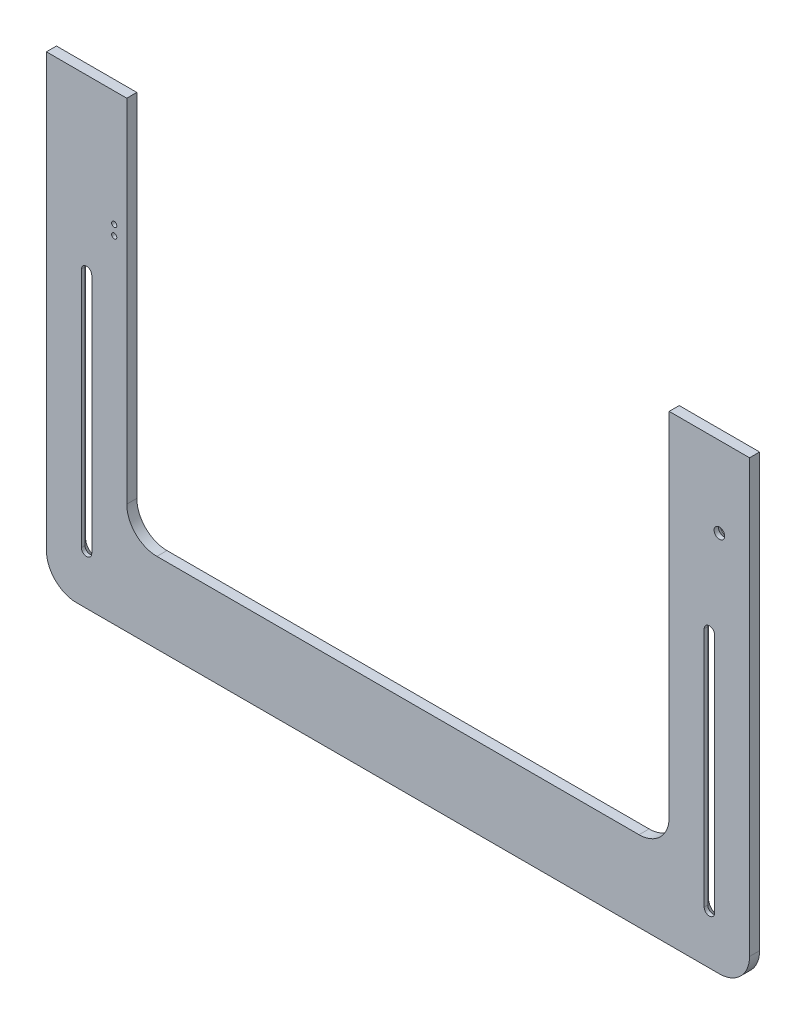
ISO-10303-21;
HEADER;
FILE_DESCRIPTION(('STEP AP214'),'2;1');
FILE_NAME('part.step','',(''),(''),'','','');
FILE_SCHEMA(('AUTOMOTIVE_DESIGN { 1 0 10303 214 1 1 1 1 }'));
ENDSEC;
DATA;
#1=APPLICATION_CONTEXT('core data for automotive mechanical design processes');
#2=APPLICATION_PROTOCOL_DEFINITION('international standard','automotive_design',2000,#1);
#3=PRODUCT_CONTEXT('',#1,'mechanical');
#4=PRODUCT('Part','Part','',(#3));
#5=PRODUCT_RELATED_PRODUCT_CATEGORY('part','',(#4));
#6=PRODUCT_DEFINITION_FORMATION('','',#4);
#7=PRODUCT_DEFINITION_CONTEXT('part definition',#1,'design');
#8=PRODUCT_DEFINITION('design','',#6,#7);
#9=PRODUCT_DEFINITION_SHAPE('','',#8);
#10=(LENGTH_UNIT() NAMED_UNIT(*) SI_UNIT(.MILLI.,.METRE.));
#11=(NAMED_UNIT(*) PLANE_ANGLE_UNIT() SI_UNIT($,.RADIAN.));
#12=(NAMED_UNIT(*) SI_UNIT($,.STERADIAN.) SOLID_ANGLE_UNIT());
#13=UNCERTAINTY_MEASURE_WITH_UNIT(LENGTH_MEASURE(1.E-05),#10,'distance_accuracy_value','');
#14=(GEOMETRIC_REPRESENTATION_CONTEXT(3) GLOBAL_UNCERTAINTY_ASSIGNED_CONTEXT((#13)) GLOBAL_UNIT_ASSIGNED_CONTEXT((#10,
#11,#12)) REPRESENTATION_CONTEXT('',''));
#15=CARTESIAN_POINT('',(0.,0.,0.));
#16=DIRECTION('',(0.,0.,1.));
#17=DIRECTION('',(1.,0.,0.));
#18=AXIS2_PLACEMENT_3D('',#15,#16,#17);
#19=CARTESIAN_POINT('',(374.65,-222.25,6.35));
#20=DIRECTION('',(0.,0.,1.));
#21=DIRECTION('',(1.,0.,0.));
#22=AXIS2_PLACEMENT_3D('',#19,#20,#21);
#23=CYLINDRICAL_SURFACE('',#22,19.05);
#24=DIRECTION('',(0.,0.,-1.));
#25=VECTOR('',#24,1.);
#26=CARTESIAN_POINT('',(374.65,-241.3,6.35));
#27=LINE('',#26,#25);
#28=CARTESIAN_POINT('',(374.65,-241.3,6.35));
#29=VERTEX_POINT('',#28);
#30=CARTESIAN_POINT('',(374.65,-241.3,0.));
#31=VERTEX_POINT('',#30);
#32=EDGE_CURVE('E351',#29,#31,#27,.T.);
#33=ORIENTED_EDGE('',*,*,#32,.F.);
#34=CARTESIAN_POINT('',(374.65,-222.25,6.35));
#35=DIRECTION('',(0.,0.,1.));
#36=DIRECTION('',(1.,0.,0.));
#37=AXIS2_PLACEMENT_3D('',#34,#35,#36);
#38=CIRCLE('',#37,19.05);
#39=CARTESIAN_POINT('',(393.7,-222.25,6.35));
#40=VERTEX_POINT('',#39);
#41=EDGE_CURVE('E357',#29,#40,#38,.T.);
#42=ORIENTED_EDGE('',*,*,#41,.T.);
#43=DIRECTION('',(0.,0.,-1.));
#44=VECTOR('',#43,1.);
#45=CARTESIAN_POINT('',(393.7,-222.25,6.35));
#46=LINE('',#45,#44);
#47=CARTESIAN_POINT('',(393.7,-222.25,0.));
#48=VERTEX_POINT('',#47);
#49=EDGE_CURVE('E354',#48,#40,#46,.F.);
#50=ORIENTED_EDGE('',*,*,#49,.F.);
#51=CARTESIAN_POINT('',(374.65,-222.25,0.));
#52=DIRECTION('',(0.,0.,1.));
#53=DIRECTION('',(1.,0.,0.));
#54=AXIS2_PLACEMENT_3D('',#51,#52,#53);
#55=CIRCLE('',#54,19.05);
#56=EDGE_CURVE('E359',#48,#31,#55,.F.);
#57=ORIENTED_EDGE('',*,*,#56,.T.);
#58=EDGE_LOOP('',(#33,#42,#50,#57));
#59=FACE_BOUND('',#58,.T.);
#60=ADVANCED_FACE('F39',(#59),#23,.F.);
#61=CARTESIAN_POINT('',(69.85,-222.25,6.35));
#62=DIRECTION('',(0.,0.,1.));
#63=DIRECTION('',(1.,0.,0.));
#64=AXIS2_PLACEMENT_3D('',#61,#62,#63);
#65=CYLINDRICAL_SURFACE('',#64,19.05);
#66=DIRECTION('',(0.,0.,-1.));
#67=VECTOR('',#66,1.);
#68=CARTESIAN_POINT('',(50.8,-222.25,6.35));
#69=LINE('',#68,#67);
#70=CARTESIAN_POINT('',(50.8,-222.25,6.35));
#71=VERTEX_POINT('',#70);
#72=CARTESIAN_POINT('',(50.8,-222.25,0.));
#73=VERTEX_POINT('',#72);
#74=EDGE_CURVE('E340',#71,#73,#69,.T.);
#75=ORIENTED_EDGE('',*,*,#74,.F.);
#76=CARTESIAN_POINT('',(69.85,-222.25,6.35));
#77=DIRECTION('',(0.,0.,1.));
#78=DIRECTION('',(1.,0.,0.));
#79=AXIS2_PLACEMENT_3D('',#76,#77,#78);
#80=CIRCLE('',#79,19.05);
#81=CARTESIAN_POINT('',(69.85,-241.3,6.35));
#82=VERTEX_POINT('',#81);
#83=EDGE_CURVE('E346',#71,#82,#80,.T.);
#84=ORIENTED_EDGE('',*,*,#83,.T.);
#85=DIRECTION('',(0.,0.,-1.));
#86=VECTOR('',#85,1.);
#87=CARTESIAN_POINT('',(69.85,-241.3,6.35));
#88=LINE('',#87,#86);
#89=CARTESIAN_POINT('',(69.85,-241.3,0.));
#90=VERTEX_POINT('',#89);
#91=EDGE_CURVE('E343',#90,#82,#88,.F.);
#92=ORIENTED_EDGE('',*,*,#91,.F.);
#93=CARTESIAN_POINT('',(69.85,-222.25,0.));
#94=DIRECTION('',(0.,0.,1.));
#95=DIRECTION('',(1.,0.,0.));
#96=AXIS2_PLACEMENT_3D('',#93,#94,#95);
#97=CIRCLE('',#96,19.05);
#98=EDGE_CURVE('E349',#90,#73,#97,.F.);
#99=ORIENTED_EDGE('',*,*,#98,.T.);
#100=EDGE_LOOP('',(#75,#84,#92,#99));
#101=FACE_BOUND('',#100,.T.);
#102=ADVANCED_FACE('F488',(#101),#65,.F.);
#103=CARTESIAN_POINT('',(425.45,-273.05,6.35));
#104=DIRECTION('',(0.,0.,1.));
#105=DIRECTION('',(1.,0.,0.));
#106=AXIS2_PLACEMENT_3D('',#103,#104,#105);
#107=CYLINDRICAL_SURFACE('',#106,19.05);
#108=DIRECTION('',(0.,0.,1.));
#109=VECTOR('',#108,1.);
#110=CARTESIAN_POINT('',(425.45,-292.1,6.35));
#111=LINE('',#110,#109);
#112=CARTESIAN_POINT('',(425.45,-292.1,0.));
#113=VERTEX_POINT('',#112);
#114=CARTESIAN_POINT('',(425.45,-292.1,6.35));
#115=VERTEX_POINT('',#114);
#116=EDGE_CURVE('E330',#113,#115,#111,.T.);
#117=ORIENTED_EDGE('',*,*,#116,.F.);
#118=CARTESIAN_POINT('',(425.45,-273.05,0.));
#119=DIRECTION('',(0.,0.,1.));
#120=DIRECTION('',(1.,0.,0.));
#121=AXIS2_PLACEMENT_3D('',#118,#119,#120);
#122=CIRCLE('',#121,19.05);
#123=CARTESIAN_POINT('',(444.5,-273.05,0.));
#124=VERTEX_POINT('',#123);
#125=EDGE_CURVE('E336',#124,#113,#122,.F.);
#126=ORIENTED_EDGE('',*,*,#125,.F.);
#127=DIRECTION('',(0.,0.,1.));
#128=VECTOR('',#127,1.);
#129=CARTESIAN_POINT('',(444.5,-273.05,6.35));
#130=LINE('',#129,#128);
#131=CARTESIAN_POINT('',(444.5,-273.05,6.35));
#132=VERTEX_POINT('',#131);
#133=EDGE_CURVE('E333',#132,#124,#130,.F.);
#134=ORIENTED_EDGE('',*,*,#133,.F.);
#135=CARTESIAN_POINT('',(425.45,-273.05,6.35));
#136=DIRECTION('',(0.,0.,1.));
#137=DIRECTION('',(1.,0.,0.));
#138=AXIS2_PLACEMENT_3D('',#135,#136,#137);
#139=CIRCLE('',#138,19.05);
#140=EDGE_CURVE('E338',#115,#132,#139,.T.);
#141=ORIENTED_EDGE('',*,*,#140,.F.);
#142=EDGE_LOOP('',(#117,#126,#134,#141));
#143=FACE_BOUND('',#142,.T.);
#144=ADVANCED_FACE('F464',(#143),#107,.T.);
#145=CARTESIAN_POINT('',(19.05,-273.05,6.35));
#146=DIRECTION('',(0.,0.,1.));
#147=DIRECTION('',(1.,0.,0.));
#148=AXIS2_PLACEMENT_3D('',#145,#146,#147);
#149=CYLINDRICAL_SURFACE('',#148,19.05);
#150=DIRECTION('',(0.,0.,1.));
#151=VECTOR('',#150,1.);
#152=CARTESIAN_POINT('',(0.,-273.05,6.35));
#153=LINE('',#152,#151);
#154=CARTESIAN_POINT('',(0.,-273.05,0.));
#155=VERTEX_POINT('',#154);
#156=CARTESIAN_POINT('',(0.,-273.05,6.35));
#157=VERTEX_POINT('',#156);
#158=EDGE_CURVE('E320',#155,#157,#153,.T.);
#159=ORIENTED_EDGE('',*,*,#158,.F.);
#160=CARTESIAN_POINT('',(19.05,-273.05,0.));
#161=DIRECTION('',(0.,0.,1.));
#162=DIRECTION('',(1.,0.,0.));
#163=AXIS2_PLACEMENT_3D('',#160,#161,#162);
#164=CIRCLE('',#163,19.05);
#165=CARTESIAN_POINT('',(19.05,-292.1,0.));
#166=VERTEX_POINT('',#165);
#167=EDGE_CURVE('E326',#166,#155,#164,.F.);
#168=ORIENTED_EDGE('',*,*,#167,.F.);
#169=DIRECTION('',(0.,0.,1.));
#170=VECTOR('',#169,1.);
#171=CARTESIAN_POINT('',(19.05,-292.1,6.35));
#172=LINE('',#171,#170);
#173=CARTESIAN_POINT('',(19.05,-292.1,6.35));
#174=VERTEX_POINT('',#173);
#175=EDGE_CURVE('E323',#174,#166,#172,.F.);
#176=ORIENTED_EDGE('',*,*,#175,.F.);
#177=CARTESIAN_POINT('',(19.05,-273.05,6.35));
#178=DIRECTION('',(0.,0.,1.));
#179=DIRECTION('',(1.,0.,0.));
#180=AXIS2_PLACEMENT_3D('',#177,#178,#179);
#181=CIRCLE('',#180,19.05);
#182=EDGE_CURVE('E328',#157,#174,#181,.T.);
#183=ORIENTED_EDGE('',*,*,#182,.F.);
#184=EDGE_LOOP('',(#159,#168,#176,#183));
#185=FACE_BOUND('',#184,.T.);
#186=ADVANCED_FACE('F471',(#185),#149,.T.);
#187=CARTESIAN_POINT('',(50.8,0.,6.35));
#188=DIRECTION('',(0.,-1.,0.));
#189=DIRECTION('',(1.,0.,0.));
#190=AXIS2_PLACEMENT_3D('',#187,#188,#189);
#191=PLANE('',#190);
#192=DIRECTION('',(-1.,0.,0.));
#193=VECTOR('',#192,1.);
#194=CARTESIAN_POINT('',(50.8,0.,0.));
#195=LINE('',#194,#193);
#196=CARTESIAN_POINT('',(50.8,0.,0.));
#197=VERTEX_POINT('',#196);
#198=CARTESIAN_POINT('',(0.,0.,0.));
#199=VERTEX_POINT('',#198);
#200=EDGE_CURVE('E255',#197,#199,#195,.T.);
#201=ORIENTED_EDGE('',*,*,#200,.T.);
#202=DIRECTION('',(0.,0.,-1.));
#203=VECTOR('',#202,1.);
#204=CARTESIAN_POINT('',(0.,0.,6.35));
#205=LINE('',#204,#203);
#206=CARTESIAN_POINT('',(0.,0.,6.35));
#207=VERTEX_POINT('',#206);
#208=EDGE_CURVE('E317',#207,#199,#205,.T.);
#209=ORIENTED_EDGE('',*,*,#208,.F.);
#210=DIRECTION('',(-1.,0.,0.));
#211=VECTOR('',#210,1.);
#212=CARTESIAN_POINT('',(50.8,0.,6.35));
#213=LINE('',#212,#211);
#214=CARTESIAN_POINT('',(50.8,0.,6.35));
#215=VERTEX_POINT('',#214);
#216=EDGE_CURVE('E261',#215,#207,#213,.T.);
#217=ORIENTED_EDGE('',*,*,#216,.F.);
#218=DIRECTION('',(0.,0.,-1.));
#219=VECTOR('',#218,1.);
#220=CARTESIAN_POINT('',(50.8,0.,6.35));
#221=LINE('',#220,#219);
#222=EDGE_CURVE('E285',#215,#197,#221,.T.);
#223=ORIENTED_EDGE('',*,*,#222,.T.);
#224=EDGE_LOOP('',(#201,#209,#217,#223));
#225=FACE_BOUND('',#224,.T.);
#226=ADVANCED_FACE('F477',(#225),#191,.F.);
#227=CARTESIAN_POINT('',(0.,0.,6.35));
#228=DIRECTION('',(1.,0.,0.));
#229=DIRECTION('',(0.,1.,0.));
#230=AXIS2_PLACEMENT_3D('',#227,#228,#229);
#231=PLANE('',#230);
#232=DIRECTION('',(0.,-1.,0.));
#233=VECTOR('',#232,1.);
#234=CARTESIAN_POINT('',(0.,0.,0.));
#235=LINE('',#234,#233);
#236=EDGE_CURVE('E288',#199,#155,#235,.T.);
#237=ORIENTED_EDGE('',*,*,#236,.T.);
#238=ORIENTED_EDGE('',*,*,#158,.T.);
#239=DIRECTION('',(0.,-1.,0.));
#240=VECTOR('',#239,1.);
#241=CARTESIAN_POINT('',(0.,0.,6.35));
#242=LINE('',#241,#240);
#243=EDGE_CURVE('E264',#207,#157,#242,.T.);
#244=ORIENTED_EDGE('',*,*,#243,.F.);
#245=ORIENTED_EDGE('',*,*,#208,.T.);
#246=EDGE_LOOP('',(#237,#238,#244,#245));
#247=FACE_BOUND('',#246,.T.);
#248=ADVANCED_FACE('F473',(#247),#231,.F.);
#249=CARTESIAN_POINT('',(0.,-292.1,6.35));
#250=DIRECTION('',(0.,1.,0.));
#251=DIRECTION('',(0.,0.,1.));
#252=AXIS2_PLACEMENT_3D('',#249,#250,#251);
#253=PLANE('',#252);
#254=DIRECTION('',(1.,0.,0.));
#255=VECTOR('',#254,1.);
#256=CARTESIAN_POINT('',(0.,-292.1,0.));
#257=LINE('',#256,#255);
#258=EDGE_CURVE('E291',#166,#113,#257,.T.);
#259=ORIENTED_EDGE('',*,*,#258,.T.);
#260=ORIENTED_EDGE('',*,*,#116,.T.);
#261=DIRECTION('',(1.,0.,0.));
#262=VECTOR('',#261,1.);
#263=CARTESIAN_POINT('',(0.,-292.1,6.35));
#264=LINE('',#263,#262);
#265=EDGE_CURVE('E268',#174,#115,#264,.T.);
#266=ORIENTED_EDGE('',*,*,#265,.F.);
#267=ORIENTED_EDGE('',*,*,#175,.T.);
#268=EDGE_LOOP('',(#259,#260,#266,#267));
#269=FACE_BOUND('',#268,.T.);
#270=ADVANCED_FACE('F466',(#269),#253,.F.);
#271=CARTESIAN_POINT('',(444.5,-292.1,6.35));
#272=DIRECTION('',(-1.,0.,0.));
#273=DIRECTION('',(0.,0.,1.));
#274=AXIS2_PLACEMENT_3D('',#271,#272,#273);
#275=PLANE('',#274);
#276=DIRECTION('',(0.,1.,0.));
#277=VECTOR('',#276,1.);
#278=CARTESIAN_POINT('',(444.5,-292.1,6.35));
#279=LINE('',#278,#277);
#280=CARTESIAN_POINT('',(444.5,0.,6.35));
#281=VERTEX_POINT('',#280);
#282=EDGE_CURVE('E271',#132,#281,#279,.T.);
#283=ORIENTED_EDGE('',*,*,#282,.F.);
#284=ORIENTED_EDGE('',*,*,#133,.T.);
#285=DIRECTION('',(0.,1.,0.));
#286=VECTOR('',#285,1.);
#287=CARTESIAN_POINT('',(444.5,-292.1,0.));
#288=LINE('',#287,#286);
#289=CARTESIAN_POINT('',(444.5,0.,0.));
#290=VERTEX_POINT('',#289);
#291=EDGE_CURVE('E294',#124,#290,#288,.T.);
#292=ORIENTED_EDGE('',*,*,#291,.T.);
#293=DIRECTION('',(0.,0.,-1.));
#294=VECTOR('',#293,1.);
#295=CARTESIAN_POINT('',(444.5,0.,6.35));
#296=LINE('',#295,#294);
#297=EDGE_CURVE('E313',#281,#290,#296,.T.);
#298=ORIENTED_EDGE('',*,*,#297,.F.);
#299=EDGE_LOOP('',(#283,#284,#292,#298));
#300=FACE_BOUND('',#299,.T.);
#301=ADVANCED_FACE('F454',(#300),#275,.F.);
#302=CARTESIAN_POINT('',(444.5,0.,6.35));
#303=DIRECTION('',(0.,-1.,0.));
#304=DIRECTION('',(1.,0.,0.));
#305=AXIS2_PLACEMENT_3D('',#302,#303,#304);
#306=PLANE('',#305);
#307=DIRECTION('',(-1.,0.,0.));
#308=VECTOR('',#307,1.);
#309=CARTESIAN_POINT('',(444.5,0.,0.));
#310=LINE('',#309,#308);
#311=CARTESIAN_POINT('',(393.7,0.,0.));
#312=VERTEX_POINT('',#311);
#313=EDGE_CURVE('E297',#290,#312,#310,.T.);
#314=ORIENTED_EDGE('',*,*,#313,.T.);
#315=DIRECTION('',(0.,0.,-1.));
#316=VECTOR('',#315,1.);
#317=CARTESIAN_POINT('',(393.7,0.,6.35));
#318=LINE('',#317,#316);
#319=CARTESIAN_POINT('',(393.7,0.,6.35));
#320=VERTEX_POINT('',#319);
#321=EDGE_CURVE('E309',#320,#312,#318,.T.);
#322=ORIENTED_EDGE('',*,*,#321,.F.);
#323=DIRECTION('',(-1.,0.,0.));
#324=VECTOR('',#323,1.);
#325=CARTESIAN_POINT('',(444.5,0.,6.35));
#326=LINE('',#325,#324);
#327=EDGE_CURVE('E274',#281,#320,#326,.T.);
#328=ORIENTED_EDGE('',*,*,#327,.F.);
#329=ORIENTED_EDGE('',*,*,#297,.T.);
#330=EDGE_LOOP('',(#314,#322,#328,#329));
#331=FACE_BOUND('',#330,.T.);
#332=ADVANCED_FACE('F458',(#331),#306,.F.);
#333=CARTESIAN_POINT('',(393.7,0.,6.35));
#334=DIRECTION('',(1.,0.,0.));
#335=DIRECTION('',(0.,1.,0.));
#336=AXIS2_PLACEMENT_3D('',#333,#334,#335);
#337=PLANE('',#336);
#338=DIRECTION('',(0.,-1.,0.));
#339=VECTOR('',#338,1.);
#340=CARTESIAN_POINT('',(393.7,0.,0.));
#341=LINE('',#340,#339);
#342=EDGE_CURVE('E300',#312,#48,#341,.T.);
#343=ORIENTED_EDGE('',*,*,#342,.T.);
#344=ORIENTED_EDGE('',*,*,#49,.T.);
#345=DIRECTION('',(0.,-1.,0.));
#346=VECTOR('',#345,1.);
#347=CARTESIAN_POINT('',(393.7,0.,6.35));
#348=LINE('',#347,#346);
#349=EDGE_CURVE('E277',#320,#40,#348,.T.);
#350=ORIENTED_EDGE('',*,*,#349,.F.);
#351=ORIENTED_EDGE('',*,*,#321,.T.);
#352=EDGE_LOOP('',(#343,#344,#350,#351));
#353=FACE_BOUND('',#352,.T.);
#354=ADVANCED_FACE('F496',(#353),#337,.F.);
#355=CARTESIAN_POINT('',(393.7,-241.3,6.35));
#356=DIRECTION('',(0.,-1.,0.));
#357=DIRECTION('',(1.,0.,0.));
#358=AXIS2_PLACEMENT_3D('',#355,#356,#357);
#359=PLANE('',#358);
#360=DIRECTION('',(-1.,0.,0.));
#361=VECTOR('',#360,1.);
#362=CARTESIAN_POINT('',(393.7,-241.3,6.35));
#363=LINE('',#362,#361);
#364=EDGE_CURVE('E281',#29,#82,#363,.T.);
#365=ORIENTED_EDGE('',*,*,#364,.F.);
#366=ORIENTED_EDGE('',*,*,#32,.T.);
#367=DIRECTION('',(-1.,0.,0.));
#368=VECTOR('',#367,1.);
#369=CARTESIAN_POINT('',(393.7,-241.3,0.));
#370=LINE('',#369,#368);
#371=EDGE_CURVE('E304',#31,#90,#370,.T.);
#372=ORIENTED_EDGE('',*,*,#371,.T.);
#373=ORIENTED_EDGE('',*,*,#91,.T.);
#374=EDGE_LOOP('',(#365,#366,#372,#373));
#375=FACE_BOUND('',#374,.T.);
#376=ADVANCED_FACE('F491',(#375),#359,.F.);
#377=CARTESIAN_POINT('',(50.8,-241.3,6.35));
#378=DIRECTION('',(-1.,0.,0.));
#379=DIRECTION('',(0.,-1.,0.));
#380=AXIS2_PLACEMENT_3D('',#377,#378,#379);
#381=PLANE('',#380);
#382=DIRECTION('',(0.,1.,0.));
#383=VECTOR('',#382,1.);
#384=CARTESIAN_POINT('',(50.8,-241.3,6.35));
#385=LINE('',#384,#383);
#386=EDGE_CURVE('E283',#71,#215,#385,.T.);
#387=ORIENTED_EDGE('',*,*,#386,.F.);
#388=ORIENTED_EDGE('',*,*,#74,.T.);
#389=DIRECTION('',(0.,1.,0.));
#390=VECTOR('',#389,1.);
#391=CARTESIAN_POINT('',(50.8,-241.3,0.));
#392=LINE('',#391,#390);
#393=EDGE_CURVE('E265',#73,#197,#392,.T.);
#394=ORIENTED_EDGE('',*,*,#393,.T.);
#395=ORIENTED_EDGE('',*,*,#222,.F.);
#396=EDGE_LOOP('',(#387,#388,#394,#395));
#397=FACE_BOUND('',#396,.T.);
#398=ADVANCED_FACE('F485',(#397),#381,.F.);
#399=CARTESIAN_POINT('',(0.,0.,6.35));
#400=DIRECTION('',(0.,0.,1.));
#401=DIRECTION('',(1.,0.,0.));
#402=AXIS2_PLACEMENT_3D('',#399,#400,#401);
#403=PLANE('',#402);
#404=CARTESIAN_POINT('',(42.8625000000001,-79.3750000000001,6.34999999999999));
#405=DIRECTION('',(0.,0.,-1.));
#406=DIRECTION('',(-1.,0.,0.));
#407=AXIS2_PLACEMENT_3D('',#404,#405,#406);
#408=CIRCLE('',#407,1.63194999999999);
#409=CARTESIAN_POINT('',(41.2305500000001,-79.3750000000001,6.34999999999999));
#410=VERTEX_POINT('',#409);
#411=EDGE_CURVE('E764',#410,#410,#408,.T.);
#412=ORIENTED_EDGE('',*,*,#411,.T.);
#413=EDGE_LOOP('',(#412));
#414=FACE_BOUND('',#413,.T.);
#415=CARTESIAN_POINT('',(42.8625000000001,-73.0250000000001,6.34999999999999));
#416=DIRECTION('',(0.,0.,-1.));
#417=DIRECTION('',(-1.,0.,0.));
#418=AXIS2_PLACEMENT_3D('',#415,#416,#417);
#419=CIRCLE('',#418,1.63194999999999);
#420=CARTESIAN_POINT('',(41.2305500000001,-73.0250000000001,6.34999999999999));
#421=VERTEX_POINT('',#420);
#422=EDGE_CURVE('E406',#421,#421,#419,.T.);
#423=ORIENTED_EDGE('',*,*,#422,.T.);
#424=EDGE_LOOP('',(#423));
#425=FACE_BOUND('',#424,.T.);
#426=CARTESIAN_POINT('',(425.45,-50.8000000000005,6.35));
#427=DIRECTION('',(0.,0.,-1.));
#428=DIRECTION('',(-1.,0.,0.));
#429=AXIS2_PLACEMENT_3D('',#426,#427,#428);
#430=CIRCLE('',#429,3.3782);
#431=CARTESIAN_POINT('',(422.0718,-50.8000000000005,6.35));
#432=VERTEX_POINT('',#431);
#433=EDGE_CURVE('E783',#432,#432,#430,.T.);
#434=ORIENTED_EDGE('',*,*,#433,.T.);
#435=EDGE_LOOP('',(#434));
#436=FACE_BOUND('',#435,.T.);
#437=CARTESIAN_POINT('',(25.4,-107.95,6.35));
#438=DIRECTION('',(0.,0.,1.));
#439=DIRECTION('',(1.,0.,0.));
#440=AXIS2_PLACEMENT_3D('',#437,#438,#439);
#441=CIRCLE('',#440,3.26389999999989);
#442=CARTESIAN_POINT('',(28.6638999999999,-107.95,6.35));
#443=VERTEX_POINT('',#442);
#444=CARTESIAN_POINT('',(22.1361000000001,-107.95,6.35));
#445=VERTEX_POINT('',#444);
#446=EDGE_CURVE('E226',#443,#445,#441,.T.);
#447=ORIENTED_EDGE('',*,*,#446,.F.);
#448=DIRECTION('',(0.,1.,0.));
#449=VECTOR('',#448,1.);
#450=CARTESIAN_POINT('',(28.6638999999999,-107.95,6.35));
#451=LINE('',#450,#449);
#452=CARTESIAN_POINT('',(28.6639,-260.35,6.35));
#453=VERTEX_POINT('',#452);
#454=EDGE_CURVE('E231',#453,#443,#451,.T.);
#455=ORIENTED_EDGE('',*,*,#454,.F.);
#456=CARTESIAN_POINT('',(25.4,-260.35,6.35));
#457=DIRECTION('',(0.,0.,1.));
#458=DIRECTION('',(1.,0.,0.));
#459=AXIS2_PLACEMENT_3D('',#456,#457,#458);
#460=CIRCLE('',#459,3.26389999999995);
#461=CARTESIAN_POINT('',(22.1361,-260.35,6.35));
#462=VERTEX_POINT('',#461);
#463=EDGE_CURVE('E209',#462,#453,#460,.T.);
#464=ORIENTED_EDGE('',*,*,#463,.F.);
#465=DIRECTION('',(0.,-1.,0.));
#466=VECTOR('',#465,1.);
#467=CARTESIAN_POINT('',(22.1361000000001,-107.95,6.35));
#468=LINE('',#467,#466);
#469=EDGE_CURVE('E220',#445,#462,#468,.T.);
#470=ORIENTED_EDGE('',*,*,#469,.F.);
#471=EDGE_LOOP('',(#447,#455,#464,#470));
#472=FACE_BOUND('',#471,.T.);
#473=CARTESIAN_POINT('',(419.1,-107.95,6.35));
#474=DIRECTION('',(0.,0.,1.));
#475=DIRECTION('',(1.,0.,0.));
#476=AXIS2_PLACEMENT_3D('',#473,#474,#475);
#477=CIRCLE('',#476,3.26389999999993);
#478=CARTESIAN_POINT('',(422.3639,-107.95,6.35));
#479=VERTEX_POINT('',#478);
#480=CARTESIAN_POINT('',(415.8361,-107.95,6.35));
#481=VERTEX_POINT('',#480);
#482=EDGE_CURVE('E238',#479,#481,#477,.T.);
#483=ORIENTED_EDGE('',*,*,#482,.F.);
#484=DIRECTION('',(0.,1.,0.));
#485=VECTOR('',#484,1.);
#486=CARTESIAN_POINT('',(422.3639,-107.95,6.35));
#487=LINE('',#486,#485);
#488=CARTESIAN_POINT('',(422.3639,-260.35,6.35));
#489=VERTEX_POINT('',#488);
#490=EDGE_CURVE('E249',#489,#479,#487,.T.);
#491=ORIENTED_EDGE('',*,*,#490,.F.);
#492=CARTESIAN_POINT('',(419.1,-260.35,6.35));
#493=DIRECTION('',(0.,0.,1.));
#494=DIRECTION('',(1.,0.,0.));
#495=AXIS2_PLACEMENT_3D('',#492,#493,#494);
#496=CIRCLE('',#495,3.2638999999999);
#497=CARTESIAN_POINT('',(415.8361,-260.35,6.35));
#498=VERTEX_POINT('',#497);
#499=EDGE_CURVE('E246',#498,#489,#496,.T.);
#500=ORIENTED_EDGE('',*,*,#499,.F.);
#501=DIRECTION('',(0.,-1.,0.));
#502=VECTOR('',#501,1.);
#503=CARTESIAN_POINT('',(415.8361,-107.95,6.35));
#504=LINE('',#503,#502);
#505=EDGE_CURVE('E243',#481,#498,#504,.T.);
#506=ORIENTED_EDGE('',*,*,#505,.F.);
#507=EDGE_LOOP('',(#483,#491,#500,#506));
#508=FACE_BOUND('',#507,.T.);
#509=ORIENTED_EDGE('',*,*,#41,.F.);
#510=ORIENTED_EDGE('',*,*,#364,.T.);
#511=ORIENTED_EDGE('',*,*,#83,.F.);
#512=ORIENTED_EDGE('',*,*,#386,.T.);
#513=ORIENTED_EDGE('',*,*,#216,.T.);
#514=ORIENTED_EDGE('',*,*,#243,.T.);
#515=ORIENTED_EDGE('',*,*,#182,.T.);
#516=ORIENTED_EDGE('',*,*,#265,.T.);
#517=ORIENTED_EDGE('',*,*,#140,.T.);
#518=ORIENTED_EDGE('',*,*,#282,.T.);
#519=ORIENTED_EDGE('',*,*,#327,.T.);
#520=ORIENTED_EDGE('',*,*,#349,.T.);
#521=EDGE_LOOP('',(#509,#510,#511,#512,#513,#514,#515,#516,#517,#518,#519,#520));
#522=FACE_BOUND('',#521,.T.);
#523=ADVANCED_FACE('F228',(#414,#425,#436,#472,#508,#522),#403,.T.);
#524=CARTESIAN_POINT('',(0.,0.,0.));
#525=DIRECTION('',(0.,0.,1.));
#526=DIRECTION('',(1.,0.,0.));
#527=AXIS2_PLACEMENT_3D('',#524,#525,#526);
#528=PLANE('',#527);
#529=CARTESIAN_POINT('',(42.8625000000001,-79.3750000000001,0.));
#530=DIRECTION('',(0.,0.,-1.));
#531=DIRECTION('',(-1.,0.,0.));
#532=AXIS2_PLACEMENT_3D('',#529,#530,#531);
#533=CIRCLE('',#532,2.8575);
#534=CARTESIAN_POINT('',(40.0050000000001,-79.3750000000001,0.));
#535=VERTEX_POINT('',#534);
#536=EDGE_CURVE('E762',#535,#535,#533,.T.);
#537=ORIENTED_EDGE('',*,*,#536,.F.);
#538=EDGE_LOOP('',(#537));
#539=FACE_BOUND('',#538,.T.);
#540=CARTESIAN_POINT('',(42.8625000000001,-73.0250000000001,0.));
#541=DIRECTION('',(0.,0.,-1.));
#542=DIRECTION('',(-1.,0.,0.));
#543=AXIS2_PLACEMENT_3D('',#540,#541,#542);
#544=CIRCLE('',#543,2.8575);
#545=CARTESIAN_POINT('',(40.0050000000001,-73.0250000000001,0.));
#546=VERTEX_POINT('',#545);
#547=EDGE_CURVE('E769',#546,#546,#544,.T.);
#548=ORIENTED_EDGE('',*,*,#547,.F.);
#549=EDGE_LOOP('',(#548));
#550=FACE_BOUND('',#549,.T.);
#551=DIRECTION('',(0.,1.,0.));
#552=VECTOR('',#551,1.);
#553=CARTESIAN_POINT('',(426.046012298752,0.,0.));
#554=LINE('',#553,#552);
#555=CARTESIAN_POINT('',(426.046012298752,-260.35,0.));
#556=VERTEX_POINT('',#555);
#557=CARTESIAN_POINT('',(426.046012298752,-107.95,0.));
#558=VERTEX_POINT('',#557);
#559=EDGE_CURVE('E377',#556,#558,#554,.T.);
#560=ORIENTED_EDGE('',*,*,#559,.T.);
#561=CARTESIAN_POINT('',(419.1,-107.95,0.));
#562=DIRECTION('',(0.,0.,1.));
#563=DIRECTION('',(1.,0.,0.));
#564=AXIS2_PLACEMENT_3D('',#561,#562,#563);
#565=CIRCLE('',#564,6.94601229875152);
#566=CARTESIAN_POINT('',(412.153987701249,-107.95,0.));
#567=VERTEX_POINT('',#566);
#568=EDGE_CURVE('E394',#558,#567,#565,.T.);
#569=ORIENTED_EDGE('',*,*,#568,.T.);
#570=DIRECTION('',(0.,-1.,0.));
#571=VECTOR('',#570,1.);
#572=CARTESIAN_POINT('',(412.153987701249,1.50125605917651E-13,0.));
#573=LINE('',#572,#571);
#574=CARTESIAN_POINT('',(412.153987701249,-260.35,0.));
#575=VERTEX_POINT('',#574);
#576=EDGE_CURVE('E392',#567,#575,#573,.T.);
#577=ORIENTED_EDGE('',*,*,#576,.T.);
#578=CARTESIAN_POINT('',(419.1,-260.35,0.));
#579=DIRECTION('',(0.,0.,1.));
#580=DIRECTION('',(1.,0.,0.));
#581=AXIS2_PLACEMENT_3D('',#578,#579,#580);
#582=CIRCLE('',#581,6.94601229875152);
#583=EDGE_CURVE('E390',#575,#556,#582,.T.);
#584=ORIENTED_EDGE('',*,*,#583,.T.);
#585=EDGE_LOOP('',(#560,#569,#577,#584));
#586=FACE_BOUND('',#585,.T.);
#587=CARTESIAN_POINT('',(25.4,-107.95,0.));
#588=DIRECTION('',(0.,0.,1.));
#589=DIRECTION('',(1.,0.,0.));
#590=AXIS2_PLACEMENT_3D('',#587,#588,#589);
#591=CIRCLE('',#590,6.94601229875149);
#592=CARTESIAN_POINT('',(32.3460122987515,-107.95,0.));
#593=VERTEX_POINT('',#592);
#594=CARTESIAN_POINT('',(18.4539877012485,-107.95,0.));
#595=VERTEX_POINT('',#594);
#596=EDGE_CURVE('E363',#593,#595,#591,.T.);
#597=ORIENTED_EDGE('',*,*,#596,.T.);
#598=DIRECTION('',(0.,-1.,0.));
#599=VECTOR('',#598,1.);
#600=CARTESIAN_POINT('',(18.4539877012486,0.,0.));
#601=LINE('',#600,#599);
#602=CARTESIAN_POINT('',(18.4539877012484,-260.35,0.));
#603=VERTEX_POINT('',#602);
#604=EDGE_CURVE('E367',#595,#603,#601,.T.);
#605=ORIENTED_EDGE('',*,*,#604,.T.);
#606=CARTESIAN_POINT('',(25.4,-260.35,0.));
#607=DIRECTION('',(0.,0.,1.));
#608=DIRECTION('',(1.,0.,0.));
#609=AXIS2_PLACEMENT_3D('',#606,#607,#608);
#610=CIRCLE('',#609,6.94601229875154);
#611=CARTESIAN_POINT('',(32.3460122987516,-260.35,0.));
#612=VERTEX_POINT('',#611);
#613=EDGE_CURVE('E365',#603,#612,#610,.T.);
#614=ORIENTED_EDGE('',*,*,#613,.T.);
#615=DIRECTION('',(0.,1.,0.));
#616=VECTOR('',#615,1.);
#617=CARTESIAN_POINT('',(32.3460122987515,0.,0.));
#618=LINE('',#617,#616);
#619=EDGE_CURVE('E361',#612,#593,#618,.T.);
#620=ORIENTED_EDGE('',*,*,#619,.T.);
#621=EDGE_LOOP('',(#597,#605,#614,#620));
#622=FACE_BOUND('',#621,.T.);
#623=CARTESIAN_POINT('',(425.45,-50.8000000000005,0.));
#624=DIRECTION('',(0.,0.,-1.));
#625=DIRECTION('',(-1.,0.,0.));
#626=AXIS2_PLACEMENT_3D('',#623,#624,#625);
#627=CIRCLE('',#626,6.43890000000003);
#628=CARTESIAN_POINT('',(419.0111,-50.8000000000005,0.));
#629=VERTEX_POINT('',#628);
#630=EDGE_CURVE('E388',#629,#629,#627,.T.);
#631=ORIENTED_EDGE('',*,*,#630,.F.);
#632=EDGE_LOOP('',(#631));
#633=FACE_BOUND('',#632,.T.);
#634=ORIENTED_EDGE('',*,*,#291,.F.);
#635=ORIENTED_EDGE('',*,*,#125,.T.);
#636=ORIENTED_EDGE('',*,*,#258,.F.);
#637=ORIENTED_EDGE('',*,*,#167,.T.);
#638=ORIENTED_EDGE('',*,*,#236,.F.);
#639=ORIENTED_EDGE('',*,*,#200,.F.);
#640=ORIENTED_EDGE('',*,*,#393,.F.);
#641=ORIENTED_EDGE('',*,*,#98,.F.);
#642=ORIENTED_EDGE('',*,*,#371,.F.);
#643=ORIENTED_EDGE('',*,*,#56,.F.);
#644=ORIENTED_EDGE('',*,*,#342,.F.);
#645=ORIENTED_EDGE('',*,*,#313,.F.);
#646=EDGE_LOOP('',(#634,#635,#636,#637,#638,#639,#640,#641,#642,#643,#644,#645));
#647=FACE_BOUND('',#646,.T.);
#648=ADVANCED_FACE('F435',(#539,#550,#586,#622,#633,#647),#528,.F.);
#649=CARTESIAN_POINT('',(419.1,-107.95,0.));
#650=DIRECTION('',(0.,0.,1.));
#651=DIRECTION('',(1.,0.,0.));
#652=AXIS2_PLACEMENT_3D('',#649,#650,#651);
#653=CYLINDRICAL_SURFACE('',#652,3.26389999999993);
#654=DIRECTION('',(0.,0.,1.));
#655=VECTOR('',#654,1.);
#656=CARTESIAN_POINT('',(415.8361,-107.95,0.));
#657=LINE('',#656,#655);
#658=CARTESIAN_POINT('',(415.8361,-107.95,4.08939999999997));
#659=VERTEX_POINT('',#658);
#660=EDGE_CURVE('E252',#659,#481,#657,.T.);
#661=ORIENTED_EDGE('',*,*,#660,.F.);
#662=CARTESIAN_POINT('',(419.1,-107.95,4.08939999999996));
#663=DIRECTION('',(0.,0.,1.));
#664=DIRECTION('',(1.,0.,0.));
#665=AXIS2_PLACEMENT_3D('',#662,#663,#664);
#666=CIRCLE('',#665,3.26389999999993);
#667=CARTESIAN_POINT('',(422.3639,-107.95,4.08939999999997));
#668=VERTEX_POINT('',#667);
#669=EDGE_CURVE('E397',#659,#668,#666,.F.);
#670=ORIENTED_EDGE('',*,*,#669,.T.);
#671=DIRECTION('',(0.,0.,1.));
#672=VECTOR('',#671,1.);
#673=CARTESIAN_POINT('',(422.3639,-107.95,0.));
#674=LINE('',#673,#672);
#675=EDGE_CURVE('E253',#668,#479,#674,.T.);
#676=ORIENTED_EDGE('',*,*,#675,.T.);
#677=ORIENTED_EDGE('',*,*,#482,.T.);
#678=EDGE_LOOP('',(#661,#670,#676,#677));
#679=FACE_BOUND('',#678,.T.);
#680=ADVANCED_FACE('F428',(#679),#653,.F.);
#681=CARTESIAN_POINT('',(422.3639,-107.95,0.));
#682=DIRECTION('',(1.,0.,0.));
#683=DIRECTION('',(0.,0.,-1.));
#684=AXIS2_PLACEMENT_3D('',#681,#682,#683);
#685=PLANE('',#684);
#686=ORIENTED_EDGE('',*,*,#675,.F.);
#687=DIRECTION('',(0.,-1.,0.));
#688=VECTOR('',#687,1.);
#689=CARTESIAN_POINT('',(422.3639,-107.95,4.08939999999997));
#690=LINE('',#689,#688);
#691=CARTESIAN_POINT('',(422.3639,-260.35,4.08939999999997));
#692=VERTEX_POINT('',#691);
#693=EDGE_CURVE('E11',#668,#692,#690,.T.);
#694=ORIENTED_EDGE('',*,*,#693,.T.);
#695=DIRECTION('',(0.,0.,1.));
#696=VECTOR('',#695,1.);
#697=CARTESIAN_POINT('',(422.3639,-260.35,0.));
#698=LINE('',#697,#696);
#699=EDGE_CURVE('E256',#692,#489,#698,.T.);
#700=ORIENTED_EDGE('',*,*,#699,.T.);
#701=ORIENTED_EDGE('',*,*,#490,.T.);
#702=EDGE_LOOP('',(#686,#694,#700,#701));
#703=FACE_BOUND('',#702,.T.);
#704=ADVANCED_FACE('F614',(#703),#685,.F.);
#705=CARTESIAN_POINT('',(419.1,-260.35,0.));
#706=DIRECTION('',(0.,0.,1.));
#707=DIRECTION('',(1.,0.,0.));
#708=AXIS2_PLACEMENT_3D('',#705,#706,#707);
#709=CYLINDRICAL_SURFACE('',#708,3.2638999999999);
#710=ORIENTED_EDGE('',*,*,#699,.F.);
#711=CARTESIAN_POINT('',(419.1,-260.35,4.08939999999997));
#712=DIRECTION('',(0.,0.,1.));
#713=DIRECTION('',(1.,0.,0.));
#714=AXIS2_PLACEMENT_3D('',#711,#712,#713);
#715=CIRCLE('',#714,3.2638999999999);
#716=CARTESIAN_POINT('',(415.8361,-260.35,4.08939999999997));
#717=VERTEX_POINT('',#716);
#718=EDGE_CURVE('E48',#692,#717,#715,.F.);
#719=ORIENTED_EDGE('',*,*,#718,.T.);
#720=DIRECTION('',(0.,0.,1.));
#721=VECTOR('',#720,1.);
#722=CARTESIAN_POINT('',(415.8361,-260.35,0.));
#723=LINE('',#722,#721);
#724=EDGE_CURVE('E258',#717,#498,#723,.T.);
#725=ORIENTED_EDGE('',*,*,#724,.T.);
#726=ORIENTED_EDGE('',*,*,#499,.T.);
#727=EDGE_LOOP('',(#710,#719,#725,#726));
#728=FACE_BOUND('',#727,.T.);
#729=ADVANCED_FACE('F607',(#728),#709,.F.);
#730=CARTESIAN_POINT('',(415.8361,-107.95,0.));
#731=DIRECTION('',(-1.,0.,0.));
#732=DIRECTION('',(0.,-1.,0.));
#733=AXIS2_PLACEMENT_3D('',#730,#731,#732);
#734=PLANE('',#733);
#735=ORIENTED_EDGE('',*,*,#724,.F.);
#736=DIRECTION('',(0.,1.,0.));
#737=VECTOR('',#736,1.);
#738=CARTESIAN_POINT('',(415.8361,-107.95,4.08939999999997));
#739=LINE('',#738,#737);
#740=EDGE_CURVE('E400',#717,#659,#739,.T.);
#741=ORIENTED_EDGE('',*,*,#740,.T.);
#742=ORIENTED_EDGE('',*,*,#660,.T.);
#743=ORIENTED_EDGE('',*,*,#505,.T.);
#744=EDGE_LOOP('',(#735,#741,#742,#743));
#745=FACE_BOUND('',#744,.T.);
#746=ADVANCED_FACE('F425',(#745),#734,.F.);
#747=CARTESIAN_POINT('',(25.4,-107.95,0.));
#748=DIRECTION('',(0.,0.,1.));
#749=DIRECTION('',(1.,0.,0.));
#750=AXIS2_PLACEMENT_3D('',#747,#748,#749);
#751=CYLINDRICAL_SURFACE('',#750,3.26389999999989);
#752=DIRECTION('',(0.,0.,1.));
#753=VECTOR('',#752,1.);
#754=CARTESIAN_POINT('',(22.1361000000001,-107.95,0.));
#755=LINE('',#754,#753);
#756=CARTESIAN_POINT('',(22.1361000000001,-107.95,4.08940000000002));
#757=VERTEX_POINT('',#756);
#758=EDGE_CURVE('E217',#757,#445,#755,.T.);
#759=ORIENTED_EDGE('',*,*,#758,.F.);
#760=CARTESIAN_POINT('',(25.4,-107.95,4.08940000000002));
#761=DIRECTION('',(0.,0.,1.));
#762=DIRECTION('',(1.,0.,0.));
#763=AXIS2_PLACEMENT_3D('',#760,#761,#762);
#764=CIRCLE('',#763,3.26389999999989);
#765=CARTESIAN_POINT('',(28.6638999999999,-107.95,4.08940000000002));
#766=VERTEX_POINT('',#765);
#767=EDGE_CURVE('E373',#757,#766,#764,.F.);
#768=ORIENTED_EDGE('',*,*,#767,.T.);
#769=DIRECTION('',(0.,0.,1.));
#770=VECTOR('',#769,1.);
#771=CARTESIAN_POINT('',(28.6638999999999,-107.95,0.));
#772=LINE('',#771,#770);
#773=EDGE_CURVE('E236',#766,#443,#772,.T.);
#774=ORIENTED_EDGE('',*,*,#773,.T.);
#775=ORIENTED_EDGE('',*,*,#446,.T.);
#776=EDGE_LOOP('',(#759,#768,#774,#775));
#777=FACE_BOUND('',#776,.T.);
#778=ADVANCED_FACE('F594',(#777),#751,.F.);
#779=CARTESIAN_POINT('',(28.6638999999999,-107.95,0.));
#780=DIRECTION('',(1.,0.,0.));
#781=DIRECTION('',(0.,1.,0.));
#782=AXIS2_PLACEMENT_3D('',#779,#780,#781);
#783=PLANE('',#782);
#784=ORIENTED_EDGE('',*,*,#773,.F.);
#785=DIRECTION('',(0.,-1.,0.));
#786=VECTOR('',#785,1.);
#787=CARTESIAN_POINT('',(28.6638999999999,-107.95,4.08940000000002));
#788=LINE('',#787,#786);
#789=CARTESIAN_POINT('',(28.6639,-260.35,4.08940000000002));
#790=VERTEX_POINT('',#789);
#791=EDGE_CURVE('E375',#766,#790,#788,.T.);
#792=ORIENTED_EDGE('',*,*,#791,.T.);
#793=DIRECTION('',(0.,0.,1.));
#794=VECTOR('',#793,1.);
#795=CARTESIAN_POINT('',(28.6639,-260.35,0.));
#796=LINE('',#795,#794);
#797=EDGE_CURVE('E216',#790,#453,#796,.T.);
#798=ORIENTED_EDGE('',*,*,#797,.T.);
#799=ORIENTED_EDGE('',*,*,#454,.T.);
#800=EDGE_LOOP('',(#784,#792,#798,#799));
#801=FACE_BOUND('',#800,.T.);
#802=ADVANCED_FACE('F587',(#801),#783,.F.);
#803=CARTESIAN_POINT('',(25.4,-260.35,0.));
#804=DIRECTION('',(0.,0.,1.));
#805=DIRECTION('',(1.,0.,0.));
#806=AXIS2_PLACEMENT_3D('',#803,#804,#805);
#807=CYLINDRICAL_SURFACE('',#806,3.26389999999995);
#808=ORIENTED_EDGE('',*,*,#797,.F.);
#809=CARTESIAN_POINT('',(25.4,-260.35,4.08940000000002));
#810=DIRECTION('',(0.,0.,1.));
#811=DIRECTION('',(1.,0.,0.));
#812=AXIS2_PLACEMENT_3D('',#809,#810,#811);
#813=CIRCLE('',#812,3.26389999999995);
#814=CARTESIAN_POINT('',(22.1361,-260.35,4.08940000000002));
#815=VERTEX_POINT('',#814);
#816=EDGE_CURVE('E212',#790,#815,#813,.F.);
#817=ORIENTED_EDGE('',*,*,#816,.T.);
#818=DIRECTION('',(0.,0.,1.));
#819=VECTOR('',#818,1.);
#820=CARTESIAN_POINT('',(22.1361,-260.35,0.));
#821=LINE('',#820,#819);
#822=EDGE_CURVE('E204',#815,#462,#821,.T.);
#823=ORIENTED_EDGE('',*,*,#822,.T.);
#824=ORIENTED_EDGE('',*,*,#463,.T.);
#825=EDGE_LOOP('',(#808,#817,#823,#824));
#826=FACE_BOUND('',#825,.T.);
#827=ADVANCED_FACE('F207',(#826),#807,.F.);
#828=CARTESIAN_POINT('',(22.1361000000001,-107.95,0.));
#829=DIRECTION('',(-1.,0.,0.));
#830=DIRECTION('',(0.,-1.,0.));
#831=AXIS2_PLACEMENT_3D('',#828,#829,#830);
#832=PLANE('',#831);
#833=ORIENTED_EDGE('',*,*,#822,.F.);
#834=DIRECTION('',(0.,1.,0.));
#835=VECTOR('',#834,1.);
#836=CARTESIAN_POINT('',(22.1361000000001,-107.95,4.08940000000002));
#837=LINE('',#836,#835);
#838=EDGE_CURVE('E370',#815,#757,#837,.T.);
#839=ORIENTED_EDGE('',*,*,#838,.T.);
#840=ORIENTED_EDGE('',*,*,#758,.T.);
#841=ORIENTED_EDGE('',*,*,#469,.T.);
#842=EDGE_LOOP('',(#833,#839,#840,#841));
#843=FACE_BOUND('',#842,.T.);
#844=ADVANCED_FACE('F221',(#843),#832,.F.);
#845=CARTESIAN_POINT('',(425.45,-50.8000000000005,0.));
#846=DIRECTION('',(0.,0.,-1.));
#847=DIRECTION('',(-1.,0.,0.));
#848=AXIS2_PLACEMENT_3D('',#845,#846,#847);
#849=CYLINDRICAL_SURFACE('',#848,3.3782);
#850=ORIENTED_EDGE('',*,*,#433,.F.);
#851=EDGE_LOOP('',(#850));
#852=FACE_BOUND('',#851,.T.);
#853=CARTESIAN_POINT('',(425.45,-50.8000000000005,3.52093258398135));
#854=DIRECTION('',(0.,0.,-1.));
#855=DIRECTION('',(-1.,0.,0.));
#856=AXIS2_PLACEMENT_3D('',#853,#854,#855);
#857=CIRCLE('',#856,3.3782);
#858=CARTESIAN_POINT('',(422.0718,-50.8000000000005,3.52093258398135));
#859=VERTEX_POINT('',#858);
#860=EDGE_CURVE('E779',#859,#859,#857,.T.);
#861=ORIENTED_EDGE('',*,*,#860,.T.);
#862=EDGE_LOOP('',(#861));
#863=FACE_BOUND('',#862,.T.);
#864=ADVANCED_FACE('F565',(#852,#863),#849,.F.);
#865=CARTESIAN_POINT('',(425.45,-50.8000000000005,0.));
#866=DIRECTION('',(0.,0.,-1.));
#867=DIRECTION('',(-1.,0.,0.));
#868=AXIS2_PLACEMENT_3D('',#865,#866,#867);
#869=CONICAL_SURFACE('',#868,6.43890000000003,0.715584993317678);
#870=ORIENTED_EDGE('',*,*,#860,.F.);
#871=EDGE_LOOP('',(#870));
#872=FACE_BOUND('',#871,.T.);
#873=ORIENTED_EDGE('',*,*,#630,.T.);
#874=EDGE_LOOP('',(#873));
#875=FACE_BOUND('',#874,.T.);
#876=ADVANCED_FACE('F528',(#872,#875),#869,.F.);
#877=CARTESIAN_POINT('',(32.3460122987515,0.,0.));
#878=DIRECTION('',(0.743144825477395,0.,0.669130606358858));
#879=DIRECTION('',(0.,1.,0.));
#880=AXIS2_PLACEMENT_3D('',#877,#878,#879);
#881=PLANE('',#880);
#882=DIRECTION('',(0.669130606358858,0.,-0.743144825477395));
#883=VECTOR('',#882,1.);
#884=CARTESIAN_POINT('',(28.6639,-260.35,4.08940000000002));
#885=LINE('',#884,#883);
#886=EDGE_CURVE('E382',#790,#612,#885,.T.);
#887=ORIENTED_EDGE('',*,*,#886,.F.);
#888=ORIENTED_EDGE('',*,*,#791,.F.);
#889=DIRECTION('',(-0.669130606358858,0.,0.743144825477395));
#890=VECTOR('',#889,1.);
#891=CARTESIAN_POINT('',(32.3460122987515,-107.95,0.));
#892=LINE('',#891,#890);
#893=EDGE_CURVE('E385',#593,#766,#892,.T.);
#894=ORIENTED_EDGE('',*,*,#893,.F.);
#895=ORIENTED_EDGE('',*,*,#619,.F.);
#896=EDGE_LOOP('',(#887,#888,#894,#895));
#897=FACE_BOUND('',#896,.T.);
#898=ADVANCED_FACE('F524',(#897),#881,.F.);
#899=CARTESIAN_POINT('',(25.4,-107.95,0.));
#900=DIRECTION('',(0.,0.,-1.));
#901=DIRECTION('',(-1.,0.,0.));
#902=AXIS2_PLACEMENT_3D('',#899,#900,#901);
#903=CONICAL_SURFACE('',#902,6.94601229875149,0.733038285837617);
#904=ORIENTED_EDGE('',*,*,#893,.T.);
#905=ORIENTED_EDGE('',*,*,#767,.F.);
#906=DIRECTION('',(0.669130606358858,0.,0.743144825477395));
#907=VECTOR('',#906,1.);
#908=CARTESIAN_POINT('',(18.4539877012485,-107.95,0.));
#909=LINE('',#908,#907);
#910=EDGE_CURVE('E380',#595,#757,#909,.T.);
#911=ORIENTED_EDGE('',*,*,#910,.F.);
#912=ORIENTED_EDGE('',*,*,#596,.F.);
#913=EDGE_LOOP('',(#904,#905,#911,#912));
#914=FACE_BOUND('',#913,.T.);
#915=ADVANCED_FACE('F520',(#914),#903,.F.);
#916=CARTESIAN_POINT('',(25.4,-260.35,0.));
#917=DIRECTION('',(0.,0.,-1.));
#918=DIRECTION('',(-1.,0.,0.));
#919=AXIS2_PLACEMENT_3D('',#916,#917,#918);
#920=CONICAL_SURFACE('',#919,6.94601229875154,0.733038285837617);
#921=ORIENTED_EDGE('',*,*,#886,.T.);
#922=ORIENTED_EDGE('',*,*,#613,.F.);
#923=DIRECTION('',(-0.669130606358857,0.,-0.743144825477395));
#924=VECTOR('',#923,1.);
#925=CARTESIAN_POINT('',(22.1361,-260.35,4.08940000000002));
#926=LINE('',#925,#924);
#927=EDGE_CURVE('E378',#815,#603,#926,.T.);
#928=ORIENTED_EDGE('',*,*,#927,.F.);
#929=ORIENTED_EDGE('',*,*,#816,.F.);
#930=EDGE_LOOP('',(#921,#922,#928,#929));
#931=FACE_BOUND('',#930,.T.);
#932=ADVANCED_FACE('F516',(#931),#920,.F.);
#933=CARTESIAN_POINT('',(18.4539877012486,0.,0.));
#934=DIRECTION('',(-0.743144825477395,0.,0.669130606358857));
#935=DIRECTION('',(0.,-1.,0.));
#936=AXIS2_PLACEMENT_3D('',#933,#934,#935);
#937=PLANE('',#936);
#938=ORIENTED_EDGE('',*,*,#910,.T.);
#939=ORIENTED_EDGE('',*,*,#838,.F.);
#940=ORIENTED_EDGE('',*,*,#927,.T.);
#941=ORIENTED_EDGE('',*,*,#604,.F.);
#942=EDGE_LOOP('',(#938,#939,#940,#941));
#943=FACE_BOUND('',#942,.T.);
#944=ADVANCED_FACE('F513',(#943),#937,.F.);
#945=CARTESIAN_POINT('',(419.1,-260.35,0.));
#946=DIRECTION('',(0.,0.,-1.));
#947=DIRECTION('',(-1.,0.,0.));
#948=AXIS2_PLACEMENT_3D('',#945,#946,#947);
#949=CONICAL_SURFACE('',#948,6.94601229875152,0.733038285837627);
#950=DIRECTION('',(-0.669130606358862,0.,-0.743144825477391));
#951=VECTOR('',#950,1.);
#952=CARTESIAN_POINT('',(415.8361,-260.35,4.08939999999997));
#953=LINE('',#952,#951);
#954=EDGE_CURVE('E407',#717,#575,#953,.T.);
#955=ORIENTED_EDGE('',*,*,#954,.F.);
#956=ORIENTED_EDGE('',*,*,#718,.F.);
#957=DIRECTION('',(-0.669130606358862,0.,0.743144825477391));
#958=VECTOR('',#957,1.);
#959=CARTESIAN_POINT('',(426.046012298752,-260.35,0.));
#960=LINE('',#959,#958);
#961=EDGE_CURVE('E43',#556,#692,#960,.T.);
#962=ORIENTED_EDGE('',*,*,#961,.F.);
#963=ORIENTED_EDGE('',*,*,#583,.F.);
#964=EDGE_LOOP('',(#955,#956,#962,#963));
#965=FACE_BOUND('',#964,.T.);
#966=ADVANCED_FACE('F41',(#965),#949,.F.);
#967=CARTESIAN_POINT('',(426.046012298752,0.,0.));
#968=DIRECTION('',(0.743144825477391,0.,0.669130606358862));
#969=DIRECTION('',(0.,1.,0.));
#970=AXIS2_PLACEMENT_3D('',#967,#968,#969);
#971=PLANE('',#970);
#972=ORIENTED_EDGE('',*,*,#961,.T.);
#973=ORIENTED_EDGE('',*,*,#693,.F.);
#974=DIRECTION('',(-0.669130606358862,0.,0.743144825477391));
#975=VECTOR('',#974,1.);
#976=CARTESIAN_POINT('',(426.046012298752,-107.95,0.));
#977=LINE('',#976,#975);
#978=EDGE_CURVE('E405',#558,#668,#977,.T.);
#979=ORIENTED_EDGE('',*,*,#978,.F.);
#980=ORIENTED_EDGE('',*,*,#559,.F.);
#981=EDGE_LOOP('',(#972,#973,#979,#980));
#982=FACE_BOUND('',#981,.T.);
#983=ADVANCED_FACE('F417',(#982),#971,.F.);
#984=CARTESIAN_POINT('',(412.153987701249,1.50125605917651E-13,0.));
#985=DIRECTION('',(-0.743144825477389,0.,0.669130606358864));
#986=DIRECTION('',(0.,-1.,0.));
#987=AXIS2_PLACEMENT_3D('',#984,#985,#986);
#988=PLANE('',#987);
#989=ORIENTED_EDGE('',*,*,#954,.T.);
#990=ORIENTED_EDGE('',*,*,#576,.F.);
#991=DIRECTION('',(-0.669130606358862,0.,-0.743144825477391));
#992=VECTOR('',#991,1.);
#993=CARTESIAN_POINT('',(415.8361,-107.95,4.08939999999997));
#994=LINE('',#993,#992);
#995=EDGE_CURVE('E403',#659,#567,#994,.T.);
#996=ORIENTED_EDGE('',*,*,#995,.F.);
#997=ORIENTED_EDGE('',*,*,#740,.F.);
#998=EDGE_LOOP('',(#989,#990,#996,#997));
#999=FACE_BOUND('',#998,.T.);
#1000=ADVANCED_FACE('F422',(#999),#988,.F.);
#1001=CARTESIAN_POINT('',(419.1,-107.95,0.));
#1002=DIRECTION('',(0.,0.,-1.));
#1003=DIRECTION('',(-1.,0.,0.));
#1004=AXIS2_PLACEMENT_3D('',#1001,#1002,#1003);
#1005=CONICAL_SURFACE('',#1004,6.94601229875152,0.733038285837624);
#1006=ORIENTED_EDGE('',*,*,#978,.T.);
#1007=ORIENTED_EDGE('',*,*,#669,.F.);
#1008=ORIENTED_EDGE('',*,*,#995,.T.);
#1009=ORIENTED_EDGE('',*,*,#568,.F.);
#1010=EDGE_LOOP('',(#1006,#1007,#1008,#1009));
#1011=FACE_BOUND('',#1010,.T.);
#1012=ADVANCED_FACE('F432',(#1011),#1005,.F.);
#1013=CARTESIAN_POINT('',(42.8625000000001,-73.0250000000001,0.));
#1014=DIRECTION('',(0.,0.,-1.));
#1015=DIRECTION('',(-1.,0.,0.));
#1016=AXIS2_PLACEMENT_3D('',#1013,#1014,#1015);
#1017=CYLINDRICAL_SURFACE('',#1016,1.63194999999999);
#1018=ORIENTED_EDGE('',*,*,#422,.F.);
#1019=EDGE_LOOP('',(#1018));
#1020=FACE_BOUND('',#1019,.T.);
#1021=CARTESIAN_POINT('',(42.8625000000001,-73.0250000000001,1.40983400146974));
#1022=DIRECTION('',(0.,0.,-1.));
#1023=DIRECTION('',(-1.,0.,0.));
#1024=AXIS2_PLACEMENT_3D('',#1021,#1022,#1023);
#1025=CIRCLE('',#1024,1.63194999999999);
#1026=CARTESIAN_POINT('',(41.2305500000001,-73.0250000000001,1.40983400146974));
#1027=VERTEX_POINT('',#1026);
#1028=EDGE_CURVE('E772',#1027,#1027,#1025,.T.);
#1029=ORIENTED_EDGE('',*,*,#1028,.T.);
#1030=EDGE_LOOP('',(#1029));
#1031=FACE_BOUND('',#1030,.T.);
#1032=ADVANCED_FACE('F532',(#1020,#1031),#1017,.F.);
#1033=CARTESIAN_POINT('',(42.8625000000001,-73.0250000000001,0.));
#1034=DIRECTION('',(0.,0.,-1.));
#1035=DIRECTION('',(-1.,0.,0.));
#1036=AXIS2_PLACEMENT_3D('',#1033,#1034,#1035);
#1037=CONICAL_SURFACE('',#1036,2.8575,0.715584993317669);
#1038=ORIENTED_EDGE('',*,*,#1028,.F.);
#1039=EDGE_LOOP('',(#1038));
#1040=FACE_BOUND('',#1039,.T.);
#1041=ORIENTED_EDGE('',*,*,#547,.T.);
#1042=EDGE_LOOP('',(#1041));
#1043=FACE_BOUND('',#1042,.T.);
#1044=ADVANCED_FACE('F721',(#1040,#1043),#1037,.F.);
#1045=CARTESIAN_POINT('',(42.8625000000001,-79.3750000000001,0.));
#1046=DIRECTION('',(0.,0.,-1.));
#1047=DIRECTION('',(-1.,0.,0.));
#1048=AXIS2_PLACEMENT_3D('',#1045,#1046,#1047);
#1049=CYLINDRICAL_SURFACE('',#1048,1.63194999999999);
#1050=ORIENTED_EDGE('',*,*,#411,.F.);
#1051=EDGE_LOOP('',(#1050));
#1052=FACE_BOUND('',#1051,.T.);
#1053=CARTESIAN_POINT('',(42.8625000000001,-79.3750000000001,1.40983400146974));
#1054=DIRECTION('',(0.,0.,-1.));
#1055=DIRECTION('',(-1.,0.,0.));
#1056=AXIS2_PLACEMENT_3D('',#1053,#1054,#1055);
#1057=CIRCLE('',#1056,1.63194999999999);
#1058=CARTESIAN_POINT('',(41.2305500000001,-79.3750000000001,1.40983400146974));
#1059=VERTEX_POINT('',#1058);
#1060=EDGE_CURVE('E759',#1059,#1059,#1057,.T.);
#1061=ORIENTED_EDGE('',*,*,#1060,.T.);
#1062=EDGE_LOOP('',(#1061));
#1063=FACE_BOUND('',#1062,.T.);
#1064=ADVANCED_FACE('F730',(#1052,#1063),#1049,.F.);
#1065=CARTESIAN_POINT('',(42.8625000000001,-79.3750000000001,0.));
#1066=DIRECTION('',(0.,0.,-1.));
#1067=DIRECTION('',(-1.,0.,0.));
#1068=AXIS2_PLACEMENT_3D('',#1065,#1066,#1067);
#1069=CONICAL_SURFACE('',#1068,2.8575,0.715584993317669);
#1070=ORIENTED_EDGE('',*,*,#1060,.F.);
#1071=EDGE_LOOP('',(#1070));
#1072=FACE_BOUND('',#1071,.T.);
#1073=ORIENTED_EDGE('',*,*,#536,.T.);
#1074=EDGE_LOOP('',(#1073));
#1075=FACE_BOUND('',#1074,.T.);
#1076=ADVANCED_FACE('F739',(#1072,#1075),#1069,.F.);
#1077=CLOSED_SHELL('',(#60,#102,#144,#186,#226,#248,#270,#301,#332,#354,#376,#398,#523,#648,
#680,#704,#729,#746,#778,#802,#827,#844,#864,#876,#898,#915,#932,#944,#966,#983,#1000,#1012,
#1032,#1044,#1064,#1076));
#1078=MANIFOLD_SOLID_BREP('B2',#1077);
#1079=ADVANCED_BREP_SHAPE_REPRESENTATION('',(#18,#1078),#14);
#1080=SHAPE_DEFINITION_REPRESENTATION(#9,#1079);
ENDSEC;
END-ISO-10303-21;
